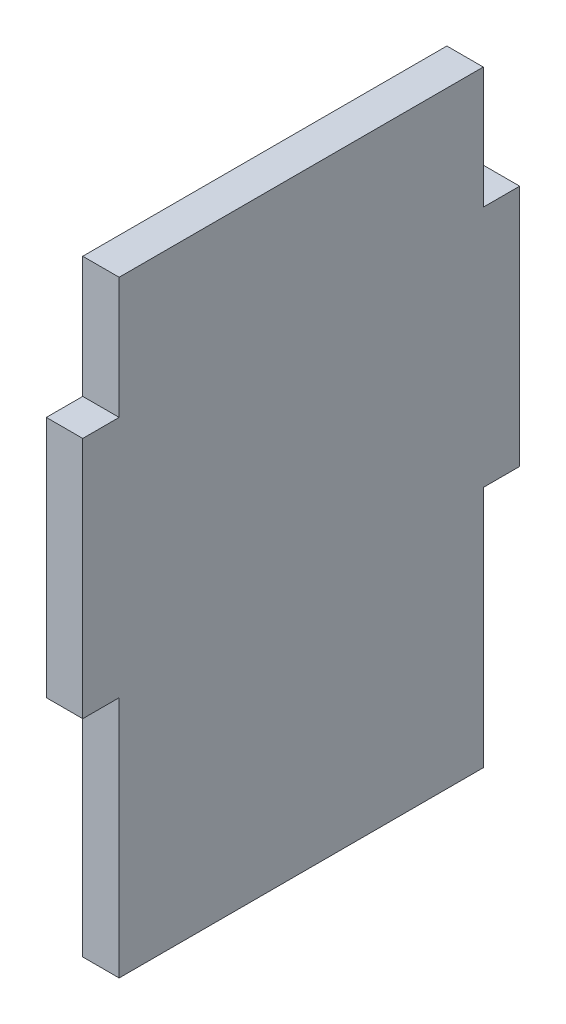
ISO-10303-21;
HEADER;
FILE_DESCRIPTION(('STEP AP214'),'2;1');
FILE_NAME('part.step','',(''),(''),'','','');
FILE_SCHEMA(('AUTOMOTIVE_DESIGN { 1 0 10303 214 1 1 1 1 }'));
ENDSEC;
DATA;
#1=APPLICATION_CONTEXT('core data for automotive mechanical design processes');
#2=APPLICATION_PROTOCOL_DEFINITION('international standard','automotive_design',2000,#1);
#3=PRODUCT_CONTEXT('',#1,'mechanical');
#4=PRODUCT('Part','Part','',(#3));
#5=PRODUCT_RELATED_PRODUCT_CATEGORY('part','',(#4));
#6=PRODUCT_DEFINITION_FORMATION('','',#4);
#7=PRODUCT_DEFINITION_CONTEXT('part definition',#1,'design');
#8=PRODUCT_DEFINITION('design','',#6,#7);
#9=PRODUCT_DEFINITION_SHAPE('','',#8);
#10=(LENGTH_UNIT() NAMED_UNIT(*) SI_UNIT(.MILLI.,.METRE.));
#11=(NAMED_UNIT(*) PLANE_ANGLE_UNIT() SI_UNIT($,.RADIAN.));
#12=(NAMED_UNIT(*) SI_UNIT($,.STERADIAN.) SOLID_ANGLE_UNIT());
#13=UNCERTAINTY_MEASURE_WITH_UNIT(LENGTH_MEASURE(1.E-05),#10,'distance_accuracy_value','');
#14=(GEOMETRIC_REPRESENTATION_CONTEXT(3) GLOBAL_UNCERTAINTY_ASSIGNED_CONTEXT((#13)) GLOBAL_UNIT_ASSIGNED_CONTEXT((#10,
#11,#12)) REPRESENTATION_CONTEXT('',''));
#15=CARTESIAN_POINT('',(0.,0.,0.));
#16=DIRECTION('',(0.,0.,1.));
#17=DIRECTION('',(1.,0.,0.));
#18=AXIS2_PLACEMENT_3D('',#15,#16,#17);
#19=CARTESIAN_POINT('',(3.,0.,-15.));
#20=DIRECTION('',(0.,0.,1.));
#21=DIRECTION('',(1.,0.,0.));
#22=AXIS2_PLACEMENT_3D('',#19,#20,#21);
#23=PLANE('',#22);
#24=DIRECTION('',(0.,1.,0.));
#25=VECTOR('',#24,1.);
#26=CARTESIAN_POINT('',(0.,0.,-15.));
#27=LINE('',#26,#25);
#28=CARTESIAN_POINT('',(0.,0.,-15.));
#29=VERTEX_POINT('',#28);
#30=CARTESIAN_POINT('',(0.,20.,-15.));
#31=VERTEX_POINT('',#30);
#32=EDGE_CURVE('E152',#29,#31,#27,.T.);
#33=ORIENTED_EDGE('',*,*,#32,.T.);
#34=DIRECTION('',(-1.,0.,0.));
#35=VECTOR('',#34,1.);
#36=CARTESIAN_POINT('',(3.,20.,-15.));
#37=LINE('',#36,#35);
#38=CARTESIAN_POINT('',(3.,20.,-15.));
#39=VERTEX_POINT('',#38);
#40=EDGE_CURVE('E11',#39,#31,#37,.T.);
#41=ORIENTED_EDGE('',*,*,#40,.F.);
#42=DIRECTION('',(0.,1.,0.));
#43=VECTOR('',#42,1.);
#44=CARTESIAN_POINT('',(3.,0.,-15.));
#45=LINE('',#44,#43);
#46=CARTESIAN_POINT('',(3.,0.,-15.));
#47=VERTEX_POINT('',#46);
#48=EDGE_CURVE('E174',#47,#39,#45,.T.);
#49=ORIENTED_EDGE('',*,*,#48,.F.);
#50=DIRECTION('',(-1.,0.,0.));
#51=VECTOR('',#50,1.);
#52=CARTESIAN_POINT('',(3.,0.,-15.));
#53=LINE('',#52,#51);
#54=EDGE_CURVE('E148',#47,#29,#53,.T.);
#55=ORIENTED_EDGE('',*,*,#54,.T.);
#56=EDGE_LOOP('',(#33,#41,#49,#55));
#57=FACE_BOUND('',#56,.T.);
#58=ADVANCED_FACE('F32',(#57),#23,.F.);
#59=CARTESIAN_POINT('',(3.,20.,-15.));
#60=DIRECTION('',(0.,1.,0.));
#61=DIRECTION('',(0.,0.,1.));
#62=AXIS2_PLACEMENT_3D('',#59,#60,#61);
#63=PLANE('',#62);
#64=DIRECTION('',(0.,0.,-1.));
#65=VECTOR('',#64,1.);
#66=CARTESIAN_POINT('',(0.,20.,-15.));
#67=LINE('',#66,#65);
#68=CARTESIAN_POINT('',(0.,20.,-18.));
#69=VERTEX_POINT('',#68);
#70=EDGE_CURVE('E155',#31,#69,#67,.T.);
#71=ORIENTED_EDGE('',*,*,#70,.T.);
#72=DIRECTION('',(-1.,0.,0.));
#73=VECTOR('',#72,1.);
#74=CARTESIAN_POINT('',(3.,20.,-18.));
#75=LINE('',#74,#73);
#76=CARTESIAN_POINT('',(3.,20.,-18.));
#77=VERTEX_POINT('',#76);
#78=EDGE_CURVE('E40',#77,#69,#75,.T.);
#79=ORIENTED_EDGE('',*,*,#78,.F.);
#80=DIRECTION('',(0.,0.,-1.));
#81=VECTOR('',#80,1.);
#82=CARTESIAN_POINT('',(3.,20.,-15.));
#83=LINE('',#82,#81);
#84=EDGE_CURVE('E103',#39,#77,#83,.T.);
#85=ORIENTED_EDGE('',*,*,#84,.F.);
#86=ORIENTED_EDGE('',*,*,#40,.T.);
#87=EDGE_LOOP('',(#71,#79,#85,#86));
#88=FACE_BOUND('',#87,.T.);
#89=ADVANCED_FACE('F252',(#88),#63,.F.);
#90=CARTESIAN_POINT('',(3.,20.,-18.));
#91=DIRECTION('',(0.,0.,1.));
#92=DIRECTION('',(1.,0.,0.));
#93=AXIS2_PLACEMENT_3D('',#90,#91,#92);
#94=PLANE('',#93);
#95=DIRECTION('',(0.,1.,0.));
#96=VECTOR('',#95,1.);
#97=CARTESIAN_POINT('',(0.,20.,-18.));
#98=LINE('',#97,#96);
#99=CARTESIAN_POINT('',(0.,40.,-18.));
#100=VERTEX_POINT('',#99);
#101=EDGE_CURVE('E157',#69,#100,#98,.T.);
#102=ORIENTED_EDGE('',*,*,#101,.T.);
#103=DIRECTION('',(-1.,0.,0.));
#104=VECTOR('',#103,1.);
#105=CARTESIAN_POINT('',(3.,40.,-18.));
#106=LINE('',#105,#104);
#107=CARTESIAN_POINT('',(3.,40.,-18.));
#108=VERTEX_POINT('',#107);
#109=EDGE_CURVE('E193',#108,#100,#106,.T.);
#110=ORIENTED_EDGE('',*,*,#109,.F.);
#111=DIRECTION('',(0.,1.,0.));
#112=VECTOR('',#111,1.);
#113=CARTESIAN_POINT('',(3.,20.,-18.));
#114=LINE('',#113,#112);
#115=EDGE_CURVE('E201',#77,#108,#114,.T.);
#116=ORIENTED_EDGE('',*,*,#115,.F.);
#117=ORIENTED_EDGE('',*,*,#78,.T.);
#118=EDGE_LOOP('',(#102,#110,#116,#117));
#119=FACE_BOUND('',#118,.T.);
#120=ADVANCED_FACE('F199',(#119),#94,.F.);
#121=CARTESIAN_POINT('',(3.,40.,-18.));
#122=DIRECTION('',(0.,-1.,0.));
#123=DIRECTION('',(0.,0.,-1.));
#124=AXIS2_PLACEMENT_3D('',#121,#122,#123);
#125=PLANE('',#124);
#126=DIRECTION('',(0.,0.,1.));
#127=VECTOR('',#126,1.);
#128=CARTESIAN_POINT('',(0.,40.,-18.));
#129=LINE('',#128,#127);
#130=CARTESIAN_POINT('',(0.,40.,-15.));
#131=VERTEX_POINT('',#130);
#132=EDGE_CURVE('E159',#100,#131,#129,.T.);
#133=ORIENTED_EDGE('',*,*,#132,.T.);
#134=DIRECTION('',(-1.,0.,0.));
#135=VECTOR('',#134,1.);
#136=CARTESIAN_POINT('',(3.,40.,-15.));
#137=LINE('',#136,#135);
#138=CARTESIAN_POINT('',(3.,40.,-15.));
#139=VERTEX_POINT('',#138);
#140=EDGE_CURVE('E190',#139,#131,#137,.T.);
#141=ORIENTED_EDGE('',*,*,#140,.F.);
#142=DIRECTION('',(0.,0.,1.));
#143=VECTOR('',#142,1.);
#144=CARTESIAN_POINT('',(3.,40.,-18.));
#145=LINE('',#144,#143);
#146=EDGE_CURVE('E219',#108,#139,#145,.T.);
#147=ORIENTED_EDGE('',*,*,#146,.F.);
#148=ORIENTED_EDGE('',*,*,#109,.T.);
#149=EDGE_LOOP('',(#133,#141,#147,#148));
#150=FACE_BOUND('',#149,.T.);
#151=ADVANCED_FACE('F210',(#150),#125,.F.);
#152=CARTESIAN_POINT('',(3.,40.,-15.));
#153=DIRECTION('',(0.,0.,1.));
#154=DIRECTION('',(0.,-1.,0.));
#155=AXIS2_PLACEMENT_3D('',#152,#153,#154);
#156=PLANE('',#155);
#157=DIRECTION('',(0.,1.,0.));
#158=VECTOR('',#157,1.);
#159=CARTESIAN_POINT('',(0.,40.,-15.));
#160=LINE('',#159,#158);
#161=CARTESIAN_POINT('',(0.,50.,-15.));
#162=VERTEX_POINT('',#161);
#163=EDGE_CURVE('E161',#131,#162,#160,.T.);
#164=ORIENTED_EDGE('',*,*,#163,.T.);
#165=DIRECTION('',(-1.,0.,0.));
#166=VECTOR('',#165,1.);
#167=CARTESIAN_POINT('',(3.,50.,-15.));
#168=LINE('',#167,#166);
#169=CARTESIAN_POINT('',(3.,50.,-15.));
#170=VERTEX_POINT('',#169);
#171=EDGE_CURVE('E187',#170,#162,#168,.T.);
#172=ORIENTED_EDGE('',*,*,#171,.F.);
#173=DIRECTION('',(0.,1.,0.));
#174=VECTOR('',#173,1.);
#175=CARTESIAN_POINT('',(3.,40.,-15.));
#176=LINE('',#175,#174);
#177=EDGE_CURVE('E216',#139,#170,#176,.T.);
#178=ORIENTED_EDGE('',*,*,#177,.F.);
#179=ORIENTED_EDGE('',*,*,#140,.T.);
#180=EDGE_LOOP('',(#164,#172,#178,#179));
#181=FACE_BOUND('',#180,.T.);
#182=ADVANCED_FACE('F214',(#181),#156,.F.);
#183=CARTESIAN_POINT('',(3.,50.,-15.));
#184=DIRECTION('',(0.,-1.,0.));
#185=DIRECTION('',(0.,0.,-1.));
#186=AXIS2_PLACEMENT_3D('',#183,#184,#185);
#187=PLANE('',#186);
#188=DIRECTION('',(0.,0.,1.));
#189=VECTOR('',#188,1.);
#190=CARTESIAN_POINT('',(0.,50.,-15.));
#191=LINE('',#190,#189);
#192=CARTESIAN_POINT('',(0.,50.,15.));
#193=VERTEX_POINT('',#192);
#194=EDGE_CURVE('E163',#162,#193,#191,.T.);
#195=ORIENTED_EDGE('',*,*,#194,.T.);
#196=DIRECTION('',(-1.,0.,0.));
#197=VECTOR('',#196,1.);
#198=CARTESIAN_POINT('',(3.,50.,15.));
#199=LINE('',#198,#197);
#200=CARTESIAN_POINT('',(3.,50.,15.));
#201=VERTEX_POINT('',#200);
#202=EDGE_CURVE('E184',#201,#193,#199,.T.);
#203=ORIENTED_EDGE('',*,*,#202,.F.);
#204=DIRECTION('',(0.,0.,1.));
#205=VECTOR('',#204,1.);
#206=CARTESIAN_POINT('',(3.,50.,-15.));
#207=LINE('',#206,#205);
#208=EDGE_CURVE('E218',#170,#201,#207,.T.);
#209=ORIENTED_EDGE('',*,*,#208,.F.);
#210=ORIENTED_EDGE('',*,*,#171,.T.);
#211=EDGE_LOOP('',(#195,#203,#209,#210));
#212=FACE_BOUND('',#211,.T.);
#213=ADVANCED_FACE('F265',(#212),#187,.F.);
#214=CARTESIAN_POINT('',(3.,40.,15.));
#215=DIRECTION('',(0.,0.,-1.));
#216=DIRECTION('',(0.,1.,0.));
#217=AXIS2_PLACEMENT_3D('',#214,#215,#216);
#218=PLANE('',#217);
#219=DIRECTION('',(0.,-1.,0.));
#220=VECTOR('',#219,1.);
#221=CARTESIAN_POINT('',(0.,40.,15.));
#222=LINE('',#221,#220);
#223=CARTESIAN_POINT('',(0.,40.,15.));
#224=VERTEX_POINT('',#223);
#225=EDGE_CURVE('E165',#193,#224,#222,.T.);
#226=ORIENTED_EDGE('',*,*,#225,.T.);
#227=DIRECTION('',(-1.,0.,0.));
#228=VECTOR('',#227,1.);
#229=CARTESIAN_POINT('',(3.,40.,15.));
#230=LINE('',#229,#228);
#231=CARTESIAN_POINT('',(3.,40.,15.));
#232=VERTEX_POINT('',#231);
#233=EDGE_CURVE('E181',#232,#224,#230,.T.);
#234=ORIENTED_EDGE('',*,*,#233,.F.);
#235=DIRECTION('',(0.,-1.,0.));
#236=VECTOR('',#235,1.);
#237=CARTESIAN_POINT('',(3.,40.,15.));
#238=LINE('',#237,#236);
#239=EDGE_CURVE('E221',#201,#232,#238,.T.);
#240=ORIENTED_EDGE('',*,*,#239,.F.);
#241=ORIENTED_EDGE('',*,*,#202,.T.);
#242=EDGE_LOOP('',(#226,#234,#240,#241));
#243=FACE_BOUND('',#242,.T.);
#244=ADVANCED_FACE('F268',(#243),#218,.F.);
#245=CARTESIAN_POINT('',(3.,40.,18.));
#246=DIRECTION('',(0.,-1.,0.));
#247=DIRECTION('',(0.,0.,-1.));
#248=AXIS2_PLACEMENT_3D('',#245,#246,#247);
#249=PLANE('',#248);
#250=DIRECTION('',(0.,0.,1.));
#251=VECTOR('',#250,1.);
#252=CARTESIAN_POINT('',(0.,40.,18.));
#253=LINE('',#252,#251);
#254=CARTESIAN_POINT('',(0.,40.,18.));
#255=VERTEX_POINT('',#254);
#256=EDGE_CURVE('E167',#224,#255,#253,.T.);
#257=ORIENTED_EDGE('',*,*,#256,.T.);
#258=DIRECTION('',(-1.,0.,0.));
#259=VECTOR('',#258,1.);
#260=CARTESIAN_POINT('',(3.,40.,18.));
#261=LINE('',#260,#259);
#262=CARTESIAN_POINT('',(3.,40.,18.));
#263=VERTEX_POINT('',#262);
#264=EDGE_CURVE('E178',#263,#255,#261,.T.);
#265=ORIENTED_EDGE('',*,*,#264,.F.);
#266=DIRECTION('',(0.,0.,1.));
#267=VECTOR('',#266,1.);
#268=CARTESIAN_POINT('',(3.,40.,18.));
#269=LINE('',#268,#267);
#270=EDGE_CURVE('E227',#232,#263,#269,.T.);
#271=ORIENTED_EDGE('',*,*,#270,.F.);
#272=ORIENTED_EDGE('',*,*,#233,.T.);
#273=EDGE_LOOP('',(#257,#265,#271,#272));
#274=FACE_BOUND('',#273,.T.);
#275=ADVANCED_FACE('F233',(#274),#249,.F.);
#276=CARTESIAN_POINT('',(3.,20.,18.));
#277=DIRECTION('',(0.,0.,-1.));
#278=DIRECTION('',(-1.,0.,0.));
#279=AXIS2_PLACEMENT_3D('',#276,#277,#278);
#280=PLANE('',#279);
#281=DIRECTION('',(0.,-1.,0.));
#282=VECTOR('',#281,1.);
#283=CARTESIAN_POINT('',(0.,20.,18.));
#284=LINE('',#283,#282);
#285=CARTESIAN_POINT('',(0.,20.,18.));
#286=VERTEX_POINT('',#285);
#287=EDGE_CURVE('E169',#255,#286,#284,.T.);
#288=ORIENTED_EDGE('',*,*,#287,.T.);
#289=DIRECTION('',(-1.,0.,0.));
#290=VECTOR('',#289,1.);
#291=CARTESIAN_POINT('',(3.,20.,18.));
#292=LINE('',#291,#290);
#293=CARTESIAN_POINT('',(3.,20.,18.));
#294=VERTEX_POINT('',#293);
#295=EDGE_CURVE('E143',#294,#286,#292,.T.);
#296=ORIENTED_EDGE('',*,*,#295,.F.);
#297=DIRECTION('',(0.,-1.,0.));
#298=VECTOR('',#297,1.);
#299=CARTESIAN_POINT('',(3.,20.,18.));
#300=LINE('',#299,#298);
#301=EDGE_CURVE('E134',#263,#294,#300,.T.);
#302=ORIENTED_EDGE('',*,*,#301,.F.);
#303=ORIENTED_EDGE('',*,*,#264,.T.);
#304=EDGE_LOOP('',(#288,#296,#302,#303));
#305=FACE_BOUND('',#304,.T.);
#306=ADVANCED_FACE('F237',(#305),#280,.F.);
#307=CARTESIAN_POINT('',(3.,20.,15.));
#308=DIRECTION('',(0.,1.,0.));
#309=DIRECTION('',(0.,0.,1.));
#310=AXIS2_PLACEMENT_3D('',#307,#308,#309);
#311=PLANE('',#310);
#312=DIRECTION('',(0.,0.,-1.));
#313=VECTOR('',#312,1.);
#314=CARTESIAN_POINT('',(0.,20.,15.));
#315=LINE('',#314,#313);
#316=CARTESIAN_POINT('',(0.,20.,15.));
#317=VERTEX_POINT('',#316);
#318=EDGE_CURVE('E142',#286,#317,#315,.T.);
#319=ORIENTED_EDGE('',*,*,#318,.T.);
#320=DIRECTION('',(-1.,0.,0.));
#321=VECTOR('',#320,1.);
#322=CARTESIAN_POINT('',(3.,20.,15.));
#323=LINE('',#322,#321);
#324=CARTESIAN_POINT('',(3.,20.,15.));
#325=VERTEX_POINT('',#324);
#326=EDGE_CURVE('E139',#325,#317,#323,.T.);
#327=ORIENTED_EDGE('',*,*,#326,.F.);
#328=DIRECTION('',(0.,0.,-1.));
#329=VECTOR('',#328,1.);
#330=CARTESIAN_POINT('',(3.,20.,15.));
#331=LINE('',#330,#329);
#332=EDGE_CURVE('E128',#294,#325,#331,.T.);
#333=ORIENTED_EDGE('',*,*,#332,.F.);
#334=ORIENTED_EDGE('',*,*,#295,.T.);
#335=EDGE_LOOP('',(#319,#327,#333,#334));
#336=FACE_BOUND('',#335,.T.);
#337=ADVANCED_FACE('F140',(#336),#311,.F.);
#338=CARTESIAN_POINT('',(3.,0.,15.));
#339=DIRECTION('',(0.,0.,-1.));
#340=DIRECTION('',(-1.,0.,0.));
#341=AXIS2_PLACEMENT_3D('',#338,#339,#340);
#342=PLANE('',#341);
#343=DIRECTION('',(0.,-1.,0.));
#344=VECTOR('',#343,1.);
#345=CARTESIAN_POINT('',(0.,0.,15.));
#346=LINE('',#345,#344);
#347=CARTESIAN_POINT('',(0.,0.,15.));
#348=VERTEX_POINT('',#347);
#349=EDGE_CURVE('E89',#317,#348,#346,.T.);
#350=ORIENTED_EDGE('',*,*,#349,.T.);
#351=DIRECTION('',(-1.,0.,0.));
#352=VECTOR('',#351,1.);
#353=CARTESIAN_POINT('',(3.,0.,15.));
#354=LINE('',#353,#352);
#355=CARTESIAN_POINT('',(3.,0.,15.));
#356=VERTEX_POINT('',#355);
#357=EDGE_CURVE('E144',#356,#348,#354,.T.);
#358=ORIENTED_EDGE('',*,*,#357,.F.);
#359=DIRECTION('',(0.,-1.,0.));
#360=VECTOR('',#359,1.);
#361=CARTESIAN_POINT('',(3.,0.,15.));
#362=LINE('',#361,#360);
#363=EDGE_CURVE('E132',#325,#356,#362,.T.);
#364=ORIENTED_EDGE('',*,*,#363,.F.);
#365=ORIENTED_EDGE('',*,*,#326,.T.);
#366=EDGE_LOOP('',(#350,#358,#364,#365));
#367=FACE_BOUND('',#366,.T.);
#368=ADVANCED_FACE('F146',(#367),#342,.F.);
#369=CARTESIAN_POINT('',(3.,0.,15.));
#370=DIRECTION('',(0.,1.,0.));
#371=DIRECTION('',(0.,0.,1.));
#372=AXIS2_PLACEMENT_3D('',#369,#370,#371);
#373=PLANE('',#372);
#374=DIRECTION('',(0.,0.,-1.));
#375=VECTOR('',#374,1.);
#376=CARTESIAN_POINT('',(0.,0.,15.));
#377=LINE('',#376,#375);
#378=EDGE_CURVE('E95',#348,#29,#377,.T.);
#379=ORIENTED_EDGE('',*,*,#378,.T.);
#380=ORIENTED_EDGE('',*,*,#54,.F.);
#381=DIRECTION('',(0.,0.,-1.));
#382=VECTOR('',#381,1.);
#383=CARTESIAN_POINT('',(3.,0.,15.));
#384=LINE('',#383,#382);
#385=EDGE_CURVE('E48',#356,#47,#384,.T.);
#386=ORIENTED_EDGE('',*,*,#385,.F.);
#387=ORIENTED_EDGE('',*,*,#357,.T.);
#388=EDGE_LOOP('',(#379,#380,#386,#387));
#389=FACE_BOUND('',#388,.T.);
#390=ADVANCED_FACE('F241',(#389),#373,.F.);
#391=CARTESIAN_POINT('',(3.,0.,0.));
#392=DIRECTION('',(-1.,0.,0.));
#393=DIRECTION('',(0.,0.,1.));
#394=AXIS2_PLACEMENT_3D('',#391,#392,#393);
#395=PLANE('',#394);
#396=ORIENTED_EDGE('',*,*,#48,.T.);
#397=ORIENTED_EDGE('',*,*,#84,.T.);
#398=ORIENTED_EDGE('',*,*,#115,.T.);
#399=ORIENTED_EDGE('',*,*,#146,.T.);
#400=ORIENTED_EDGE('',*,*,#177,.T.);
#401=ORIENTED_EDGE('',*,*,#208,.T.);
#402=ORIENTED_EDGE('',*,*,#239,.T.);
#403=ORIENTED_EDGE('',*,*,#270,.T.);
#404=ORIENTED_EDGE('',*,*,#301,.T.);
#405=ORIENTED_EDGE('',*,*,#332,.T.);
#406=ORIENTED_EDGE('',*,*,#363,.T.);
#407=ORIENTED_EDGE('',*,*,#385,.T.);
#408=EDGE_LOOP('',(#396,#397,#398,#399,#400,#401,#402,#403,#404,#405,#406,#407));
#409=FACE_BOUND('',#408,.T.);
#410=ADVANCED_FACE('F130',(#409),#395,.F.);
#411=CARTESIAN_POINT('',(0.,0.,0.));
#412=DIRECTION('',(-1.,0.,0.));
#413=DIRECTION('',(0.,0.,1.));
#414=AXIS2_PLACEMENT_3D('',#411,#412,#413);
#415=PLANE('',#414);
#416=ORIENTED_EDGE('',*,*,#32,.F.);
#417=ORIENTED_EDGE('',*,*,#378,.F.);
#418=ORIENTED_EDGE('',*,*,#349,.F.);
#419=ORIENTED_EDGE('',*,*,#318,.F.);
#420=ORIENTED_EDGE('',*,*,#287,.F.);
#421=ORIENTED_EDGE('',*,*,#256,.F.);
#422=ORIENTED_EDGE('',*,*,#225,.F.);
#423=ORIENTED_EDGE('',*,*,#194,.F.);
#424=ORIENTED_EDGE('',*,*,#163,.F.);
#425=ORIENTED_EDGE('',*,*,#132,.F.);
#426=ORIENTED_EDGE('',*,*,#101,.F.);
#427=ORIENTED_EDGE('',*,*,#70,.F.);
#428=EDGE_LOOP('',(#416,#417,#418,#419,#420,#421,#422,#423,#424,#425,#426,#427));
#429=FACE_BOUND('',#428,.T.);
#430=ADVANCED_FACE('F205',(#429),#415,.T.);
#431=CLOSED_SHELL('',(#58,#89,#120,#151,#182,#213,#244,#275,#306,#337,#368,#390,#410,#430));
#432=MANIFOLD_SOLID_BREP('B2',#431);
#433=ADVANCED_BREP_SHAPE_REPRESENTATION('',(#18,#432),#14);
#434=SHAPE_DEFINITION_REPRESENTATION(#9,#433);
ENDSEC;
END-ISO-10303-21;
